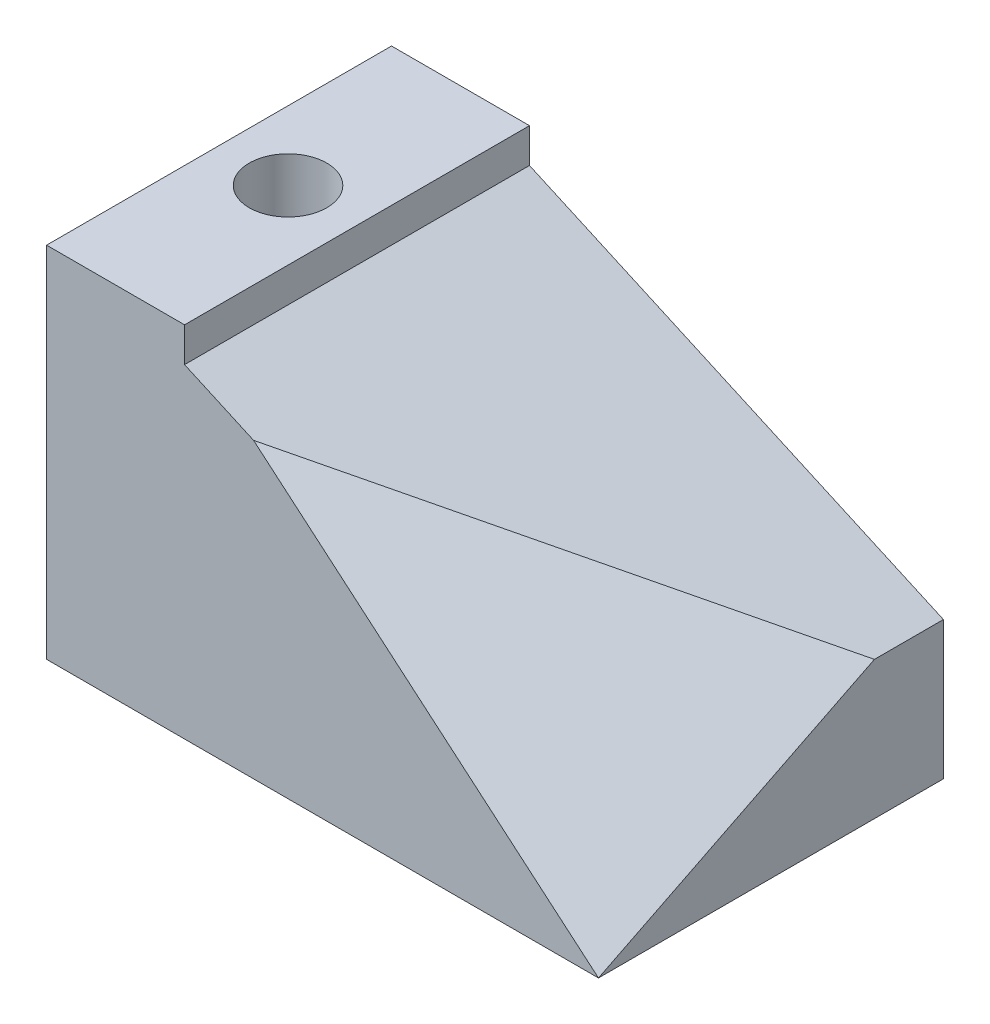
ISO-10303-21;
HEADER;
FILE_DESCRIPTION(('STEP AP214'),'2;1');
FILE_NAME('part.step','',(''),(''),'','','');
FILE_SCHEMA(('AUTOMOTIVE_DESIGN { 1 0 10303 214 1 1 1 1 }'));
ENDSEC;
DATA;
#1=APPLICATION_CONTEXT('core data for automotive mechanical design processes');
#2=APPLICATION_PROTOCOL_DEFINITION('international standard','automotive_design',2000,#1);
#3=PRODUCT_CONTEXT('',#1,'mechanical');
#4=PRODUCT('Part','Part','',(#3));
#5=PRODUCT_RELATED_PRODUCT_CATEGORY('part','',(#4));
#6=PRODUCT_DEFINITION_FORMATION('','',#4);
#7=PRODUCT_DEFINITION_CONTEXT('part definition',#1,'design');
#8=PRODUCT_DEFINITION('design','',#6,#7);
#9=PRODUCT_DEFINITION_SHAPE('','',#8);
#10=(LENGTH_UNIT() NAMED_UNIT(*) SI_UNIT(.MILLI.,.METRE.));
#11=(NAMED_UNIT(*) PLANE_ANGLE_UNIT() SI_UNIT($,.RADIAN.));
#12=(NAMED_UNIT(*) SI_UNIT($,.STERADIAN.) SOLID_ANGLE_UNIT());
#13=UNCERTAINTY_MEASURE_WITH_UNIT(LENGTH_MEASURE(1.E-05),#10,'distance_accuracy_value','');
#14=(GEOMETRIC_REPRESENTATION_CONTEXT(3) GLOBAL_UNCERTAINTY_ASSIGNED_CONTEXT((#13)) GLOBAL_UNIT_ASSIGNED_CONTEXT((#10,
#11,#12)) REPRESENTATION_CONTEXT('',''));
#15=CARTESIAN_POINT('',(0.,0.,0.));
#16=DIRECTION('',(0.,0.,1.));
#17=DIRECTION('',(1.,0.,0.));
#18=AXIS2_PLACEMENT_3D('',#15,#16,#17);
#19=CARTESIAN_POINT('',(0.,0.,63.5));
#20=DIRECTION('',(0.,0.,1.));
#21=DIRECTION('',(1.,0.,0.));
#22=AXIS2_PLACEMENT_3D('',#19,#20,#21);
#23=PLANE('',#22);
#24=DIRECTION('',(1.,0.,0.));
#25=VECTOR('',#24,1.);
#26=CARTESIAN_POINT('',(0.,0.,63.5));
#27=LINE('',#26,#25);
#28=CARTESIAN_POINT('',(0.,0.,63.5));
#29=VERTEX_POINT('',#28);
#30=CARTESIAN_POINT('',(101.6,0.,63.5));
#31=VERTEX_POINT('',#30);
#32=EDGE_CURVE('E124',#29,#31,#27,.T.);
#33=ORIENTED_EDGE('',*,*,#32,.T.);
#34=DIRECTION('',(0.761939317759459,-0.647648420095541,0.));
#35=VECTOR('',#34,1.);
#36=CARTESIAN_POINT('',(38.1,53.975,63.5));
#37=LINE('',#36,#35);
#38=CARTESIAN_POINT('',(38.1,53.975,63.5));
#39=VERTEX_POINT('',#38);
#40=EDGE_CURVE('E129',#39,#31,#37,.T.);
#41=ORIENTED_EDGE('',*,*,#40,.F.);
#42=DIRECTION('',(-0.911921505175106,0.410364677328798,0.));
#43=VECTOR('',#42,1.);
#44=CARTESIAN_POINT('',(101.6,25.4,63.5));
#45=LINE('',#44,#43);
#46=CARTESIAN_POINT('',(25.4,59.69,63.5));
#47=VERTEX_POINT('',#46);
#48=EDGE_CURVE('E147',#39,#47,#45,.T.);
#49=ORIENTED_EDGE('',*,*,#48,.T.);
#50=DIRECTION('',(0.,1.,0.));
#51=VECTOR('',#50,1.);
#52=CARTESIAN_POINT('',(25.4,59.69,63.5));
#53=LINE('',#52,#51);
#54=CARTESIAN_POINT('',(25.4,66.04,63.5));
#55=VERTEX_POINT('',#54);
#56=EDGE_CURVE('E179',#47,#55,#53,.T.);
#57=ORIENTED_EDGE('',*,*,#56,.T.);
#58=DIRECTION('',(-1.,0.,0.));
#59=VECTOR('',#58,1.);
#60=CARTESIAN_POINT('',(25.4,66.04,63.5));
#61=LINE('',#60,#59);
#62=CARTESIAN_POINT('',(0.,66.04,63.5));
#63=VERTEX_POINT('',#62);
#64=EDGE_CURVE('E90',#55,#63,#61,.T.);
#65=ORIENTED_EDGE('',*,*,#64,.T.);
#66=DIRECTION('',(0.,-1.,0.));
#67=VECTOR('',#66,1.);
#68=CARTESIAN_POINT('',(0.,66.04,63.5));
#69=LINE('',#68,#67);
#70=EDGE_CURVE('E145',#63,#29,#69,.T.);
#71=ORIENTED_EDGE('',*,*,#70,.T.);
#72=EDGE_LOOP('',(#33,#41,#49,#57,#65,#71));
#73=FACE_BOUND('',#72,.T.);
#74=ADVANCED_FACE('F64',(#73),#23,.T.);
#75=CARTESIAN_POINT('',(0.,66.04,63.5));
#76=DIRECTION('',(1.,0.,0.));
#77=DIRECTION('',(0.,1.,0.));
#78=AXIS2_PLACEMENT_3D('',#75,#76,#77);
#79=PLANE('',#78);
#80=DIRECTION('',(0.,-1.,0.));
#81=VECTOR('',#80,1.);
#82=CARTESIAN_POINT('',(0.,66.04,0.));
#83=LINE('',#82,#81);
#84=CARTESIAN_POINT('',(0.,66.04,0.));
#85=VERTEX_POINT('',#84);
#86=CARTESIAN_POINT('',(0.,0.,0.));
#87=VERTEX_POINT('',#86);
#88=EDGE_CURVE('E174',#85,#87,#83,.T.);
#89=ORIENTED_EDGE('',*,*,#88,.T.);
#90=DIRECTION('',(0.,0.,-1.));
#91=VECTOR('',#90,1.);
#92=CARTESIAN_POINT('',(0.,0.,63.5));
#93=LINE('',#92,#91);
#94=EDGE_CURVE('E12',#29,#87,#93,.T.);
#95=ORIENTED_EDGE('',*,*,#94,.F.);
#96=ORIENTED_EDGE('',*,*,#70,.F.);
#97=DIRECTION('',(0.,0.,-1.));
#98=VECTOR('',#97,1.);
#99=CARTESIAN_POINT('',(0.,66.04,63.5));
#100=LINE('',#99,#98);
#101=EDGE_CURVE('E164',#63,#85,#100,.T.);
#102=ORIENTED_EDGE('',*,*,#101,.T.);
#103=EDGE_LOOP('',(#89,#95,#96,#102));
#104=FACE_BOUND('',#103,.T.);
#105=ADVANCED_FACE('F66',(#104),#79,.F.);
#106=CARTESIAN_POINT('',(0.,0.,63.5));
#107=DIRECTION('',(0.,1.,0.));
#108=DIRECTION('',(0.,0.,1.));
#109=AXIS2_PLACEMENT_3D('',#106,#107,#108);
#110=PLANE('',#109);
#111=DIRECTION('',(1.,0.,0.));
#112=VECTOR('',#111,1.);
#113=CARTESIAN_POINT('',(0.,0.,0.));
#114=LINE('',#113,#112);
#115=CARTESIAN_POINT('',(101.6,0.,0.));
#116=VERTEX_POINT('',#115);
#117=EDGE_CURVE('E150',#87,#116,#114,.T.);
#118=ORIENTED_EDGE('',*,*,#117,.T.);
#119=DIRECTION('',(0.,0.,-1.));
#120=VECTOR('',#119,1.);
#121=CARTESIAN_POINT('',(101.6,0.,63.5));
#122=LINE('',#121,#120);
#123=EDGE_CURVE('E73',#31,#116,#122,.T.);
#124=ORIENTED_EDGE('',*,*,#123,.F.);
#125=ORIENTED_EDGE('',*,*,#32,.F.);
#126=ORIENTED_EDGE('',*,*,#94,.T.);
#127=EDGE_LOOP('',(#118,#124,#125,#126));
#128=FACE_BOUND('',#127,.T.);
#129=ADVANCED_FACE('F149',(#128),#110,.F.);
#130=CARTESIAN_POINT('',(101.6,0.,63.5));
#131=DIRECTION('',(-1.,0.,0.));
#132=DIRECTION('',(0.,0.,1.));
#133=AXIS2_PLACEMENT_3D('',#130,#131,#132);
#134=PLANE('',#133);
#135=DIRECTION('',(0.,0.,-1.));
#136=VECTOR('',#135,1.);
#137=CARTESIAN_POINT('',(101.6,25.4,63.5));
#138=LINE('',#137,#136);
#139=CARTESIAN_POINT('',(101.6,25.4,12.7));
#140=VERTEX_POINT('',#139);
#141=CARTESIAN_POINT('',(101.6,25.4,0.));
#142=VERTEX_POINT('',#141);
#143=EDGE_CURVE('E142',#140,#142,#138,.T.);
#144=ORIENTED_EDGE('',*,*,#143,.F.);
#145=DIRECTION('',(0.,0.447213595499958,-0.894427190999916));
#146=VECTOR('',#145,1.);
#147=CARTESIAN_POINT('',(101.6,0.,63.5));
#148=LINE('',#147,#146);
#149=EDGE_CURVE('E132',#31,#140,#148,.T.);
#150=ORIENTED_EDGE('',*,*,#149,.F.);
#151=ORIENTED_EDGE('',*,*,#123,.T.);
#152=DIRECTION('',(0.,1.,0.));
#153=VECTOR('',#152,1.);
#154=CARTESIAN_POINT('',(101.6,0.,0.));
#155=LINE('',#154,#153);
#156=EDGE_CURVE('E171',#116,#142,#155,.T.);
#157=ORIENTED_EDGE('',*,*,#156,.T.);
#158=EDGE_LOOP('',(#144,#150,#151,#157));
#159=FACE_BOUND('',#158,.T.);
#160=ADVANCED_FACE('F139',(#159),#134,.F.);
#161=CARTESIAN_POINT('',(101.6,25.4,63.5));
#162=DIRECTION('',(-0.410364677328798,-0.911921505175106,0.));
#163=DIRECTION('',(0.911921505175107,-0.410364677328798,0.));
#164=AXIS2_PLACEMENT_3D('',#161,#162,#163);
#165=PLANE('',#164);
#166=ORIENTED_EDGE('',*,*,#48,.F.);
#167=DIRECTION('',(-0.736709468683757,0.331519260907691,0.589367574947006));
#168=VECTOR('',#167,1.);
#169=CARTESIAN_POINT('',(38.1,53.975,63.5));
#170=LINE('',#169,#168);
#171=EDGE_CURVE('E81',#140,#39,#170,.T.);
#172=ORIENTED_EDGE('',*,*,#171,.F.);
#173=ORIENTED_EDGE('',*,*,#143,.T.);
#174=DIRECTION('',(-0.911921505175106,0.410364677328798,0.));
#175=VECTOR('',#174,1.);
#176=CARTESIAN_POINT('',(101.6,25.4,0.));
#177=LINE('',#176,#175);
#178=CARTESIAN_POINT('',(25.4,59.69,0.));
#179=VERTEX_POINT('',#178);
#180=EDGE_CURVE('E169',#142,#179,#177,.T.);
#181=ORIENTED_EDGE('',*,*,#180,.T.);
#182=DIRECTION('',(0.,0.,-1.));
#183=VECTOR('',#182,1.);
#184=CARTESIAN_POINT('',(25.4,59.69,63.5));
#185=LINE('',#184,#183);
#186=EDGE_CURVE('E151',#47,#179,#185,.T.);
#187=ORIENTED_EDGE('',*,*,#186,.F.);
#188=EDGE_LOOP('',(#166,#172,#173,#181,#187));
#189=FACE_BOUND('',#188,.T.);
#190=ADVANCED_FACE('F214',(#189),#165,.F.);
#191=CARTESIAN_POINT('',(25.4,59.69,63.5));
#192=DIRECTION('',(-1.,0.,0.));
#193=DIRECTION('',(0.,0.,1.));
#194=AXIS2_PLACEMENT_3D('',#191,#192,#193);
#195=PLANE('',#194);
#196=DIRECTION('',(0.,1.,0.));
#197=VECTOR('',#196,1.);
#198=CARTESIAN_POINT('',(25.4,59.69,0.));
#199=LINE('',#198,#197);
#200=CARTESIAN_POINT('',(25.4,66.04,0.));
#201=VERTEX_POINT('',#200);
#202=EDGE_CURVE('E167',#179,#201,#199,.T.);
#203=ORIENTED_EDGE('',*,*,#202,.T.);
#204=DIRECTION('',(0.,0.,-1.));
#205=VECTOR('',#204,1.);
#206=CARTESIAN_POINT('',(25.4,66.04,63.5));
#207=LINE('',#206,#205);
#208=EDGE_CURVE('E162',#55,#201,#207,.T.);
#209=ORIENTED_EDGE('',*,*,#208,.F.);
#210=ORIENTED_EDGE('',*,*,#56,.F.);
#211=ORIENTED_EDGE('',*,*,#186,.T.);
#212=EDGE_LOOP('',(#203,#209,#210,#211));
#213=FACE_BOUND('',#212,.T.);
#214=ADVANCED_FACE('F206',(#213),#195,.F.);
#215=CARTESIAN_POINT('',(25.4,66.04,63.5));
#216=DIRECTION('',(0.,-1.,0.));
#217=DIRECTION('',(0.,0.,-1.));
#218=AXIS2_PLACEMENT_3D('',#215,#216,#217);
#219=PLANE('',#218);
#220=CARTESIAN_POINT('',(12.7,66.04,31.75));
#221=DIRECTION('',(0.,1.,0.));
#222=DIRECTION('',(0.,0.,1.));
#223=AXIS2_PLACEMENT_3D('',#220,#221,#222);
#224=CIRCLE('',#223,7.1374);
#225=CARTESIAN_POINT('',(12.7,66.04,38.8874));
#226=VERTEX_POINT('',#225);
#227=EDGE_CURVE('E134',#226,#226,#224,.T.);
#228=ORIENTED_EDGE('',*,*,#227,.F.);
#229=EDGE_LOOP('',(#228));
#230=FACE_BOUND('',#229,.T.);
#231=DIRECTION('',(-1.,0.,0.));
#232=VECTOR('',#231,1.);
#233=CARTESIAN_POINT('',(25.4,66.04,0.));
#234=LINE('',#233,#232);
#235=EDGE_CURVE('E117',#201,#85,#234,.T.);
#236=ORIENTED_EDGE('',*,*,#235,.T.);
#237=ORIENTED_EDGE('',*,*,#101,.F.);
#238=ORIENTED_EDGE('',*,*,#64,.F.);
#239=ORIENTED_EDGE('',*,*,#208,.T.);
#240=EDGE_LOOP('',(#236,#237,#238,#239));
#241=FACE_BOUND('',#240,.T.);
#242=ADVANCED_FACE('F204',(#230,#241),#219,.F.);
#243=CARTESIAN_POINT('',(0.,0.,0.));
#244=DIRECTION('',(0.,0.,1.));
#245=DIRECTION('',(1.,0.,0.));
#246=AXIS2_PLACEMENT_3D('',#243,#244,#245);
#247=PLANE('',#246);
#248=ORIENTED_EDGE('',*,*,#88,.F.);
#249=ORIENTED_EDGE('',*,*,#235,.F.);
#250=ORIENTED_EDGE('',*,*,#202,.F.);
#251=ORIENTED_EDGE('',*,*,#180,.F.);
#252=ORIENTED_EDGE('',*,*,#156,.F.);
#253=ORIENTED_EDGE('',*,*,#117,.F.);
#254=EDGE_LOOP('',(#248,#249,#250,#251,#252,#253));
#255=FACE_BOUND('',#254,.T.);
#256=ADVANCED_FACE('F200',(#255),#247,.F.);
#257=CARTESIAN_POINT('',(12.7,27.94,31.75));
#258=DIRECTION('',(0.,1.,0.));
#259=DIRECTION('',(0.,0.,1.));
#260=AXIS2_PLACEMENT_3D('',#257,#258,#259);
#261=CYLINDRICAL_SURFACE('',#260,7.1374);
#262=CARTESIAN_POINT('',(12.7,27.94,31.75));
#263=DIRECTION('',(0.,1.,0.));
#264=DIRECTION('',(0.,0.,1.));
#265=AXIS2_PLACEMENT_3D('',#262,#263,#264);
#266=CIRCLE('',#265,7.1374);
#267=CARTESIAN_POINT('',(12.7,27.94,38.8874));
#268=VERTEX_POINT('',#267);
#269=EDGE_CURVE('E177',#268,#268,#266,.T.);
#270=CARTESIAN_POINT('',(12.7,27.94,38.8874));
#271=CARTESIAN_POINT('',(12.7,28.336875,38.8874));
#272=CARTESIAN_POINT('',(12.7,28.73375,38.8874));
#273=CARTESIAN_POINT('',(12.7,29.5275,38.8874));
#274=CARTESIAN_POINT('',(12.7,29.924375,38.8874));
#275=CARTESIAN_POINT('',(12.7,30.718125,38.8874));
#276=CARTESIAN_POINT('',(12.7,31.115,38.8874));
#277=CARTESIAN_POINT('',(12.7,31.90875,38.8874));
#278=CARTESIAN_POINT('',(12.7,32.305625,38.8874));
#279=CARTESIAN_POINT('',(12.7,33.099375,38.8874));
#280=CARTESIAN_POINT('',(12.7,33.49625,38.8874));
#281=CARTESIAN_POINT('',(12.7,34.29,38.8874));
#282=CARTESIAN_POINT('',(12.7,34.686875,38.8874));
#283=CARTESIAN_POINT('',(12.7,35.480625,38.8874));
#284=CARTESIAN_POINT('',(12.7,35.8775,38.8874));
#285=CARTESIAN_POINT('',(12.7,36.67125,38.8874));
#286=CARTESIAN_POINT('',(12.7,37.068125,38.8874));
#287=CARTESIAN_POINT('',(12.7,37.861875,38.8874));
#288=CARTESIAN_POINT('',(12.7,38.25875,38.8874));
#289=CARTESIAN_POINT('',(12.7,39.0525,38.8874));
#290=CARTESIAN_POINT('',(12.7,39.449375,38.8874));
#291=CARTESIAN_POINT('',(12.7,40.243125,38.8874));
#292=CARTESIAN_POINT('',(12.7,40.64,38.8874));
#293=CARTESIAN_POINT('',(12.7,41.43375,38.8874));
#294=CARTESIAN_POINT('',(12.7,41.830625,38.8874));
#295=CARTESIAN_POINT('',(12.7,42.624375,38.8874));
#296=CARTESIAN_POINT('',(12.7,43.02125,38.8874));
#297=CARTESIAN_POINT('',(12.7,43.815,38.8874));
#298=CARTESIAN_POINT('',(12.7,44.211875,38.8874));
#299=CARTESIAN_POINT('',(12.7,45.005625,38.8874));
#300=CARTESIAN_POINT('',(12.7,45.4025,38.8874));
#301=CARTESIAN_POINT('',(12.7,46.19625,38.8874));
#302=CARTESIAN_POINT('',(12.7,46.593125,38.8874));
#303=CARTESIAN_POINT('',(12.7,47.386875,38.8874));
#304=CARTESIAN_POINT('',(12.7,47.78375,38.8874));
#305=CARTESIAN_POINT('',(12.7,48.5775,38.8874));
#306=CARTESIAN_POINT('',(12.7,48.974375,38.8874));
#307=CARTESIAN_POINT('',(12.7,49.768125,38.8874));
#308=CARTESIAN_POINT('',(12.7,50.165,38.8874));
#309=CARTESIAN_POINT('',(12.7,50.95875,38.8874));
#310=CARTESIAN_POINT('',(12.7,51.355625,38.8874));
#311=CARTESIAN_POINT('',(12.7,52.149375,38.8874));
#312=CARTESIAN_POINT('',(12.7,52.54625,38.8874));
#313=CARTESIAN_POINT('',(12.7,53.34,38.8874));
#314=CARTESIAN_POINT('',(12.7,53.736875,38.8874));
#315=CARTESIAN_POINT('',(12.7,54.530625,38.8874));
#316=CARTESIAN_POINT('',(12.7,54.9275,38.8874));
#317=CARTESIAN_POINT('',(12.7,55.72125,38.8874));
#318=CARTESIAN_POINT('',(12.7,56.118125,38.8874));
#319=CARTESIAN_POINT('',(12.7,56.911875,38.8874));
#320=CARTESIAN_POINT('',(12.7,57.30875,38.8874));
#321=CARTESIAN_POINT('',(12.7,58.1025,38.8874));
#322=CARTESIAN_POINT('',(12.7,58.499375,38.8874));
#323=CARTESIAN_POINT('',(12.7,59.293125,38.8874));
#324=CARTESIAN_POINT('',(12.7,59.69,38.8874));
#325=CARTESIAN_POINT('',(12.7,60.48375,38.8874));
#326=CARTESIAN_POINT('',(12.7,60.880625,38.8874));
#327=CARTESIAN_POINT('',(12.7,61.674375,38.8874));
#328=CARTESIAN_POINT('',(12.7,62.07125,38.8874));
#329=CARTESIAN_POINT('',(12.7,62.865,38.8874));
#330=CARTESIAN_POINT('',(12.7,63.261875,38.8874));
#331=CARTESIAN_POINT('',(12.7,64.055625,38.8874));
#332=CARTESIAN_POINT('',(12.7,64.4525,38.8874));
#333=CARTESIAN_POINT('',(12.7,65.24625,38.8874));
#334=CARTESIAN_POINT('',(12.7,65.643125,38.8874));
#335=CARTESIAN_POINT('',(12.7,66.04,38.8874));
#336=B_SPLINE_CURVE_WITH_KNOTS('',3,(#270,#271,#272,#273,#274,#275,#276,#277,#278,#279,#280,
#281,#282,#283,#284,#285,#286,#287,#288,#289,#290,#291,#292,#293,#294,#295,#296,#297,#298,#299,
#300,#301,#302,#303,#304,#305,#306,#307,#308,#309,#310,#311,#312,#313,#314,#315,#316,#317,#318,
#319,#320,#321,#322,#323,#324,#325,#326,#327,#328,#329,#330,#331,#332,#333,#334,#335),
.UNSPECIFIED.,.F.,.F.,(4,2,2,2,2,2,2,2,2,2,2,2,2,2,2,2,2,2,2,2,2,2,2,2,2,2,2,2,2,2,2,2,4),(0.,
1.190625,2.38125,3.571875,4.7625,5.953125,7.14375,8.334375,9.525,10.715625,11.90625,13.096875,
14.2875,15.478125,16.66875,17.859375,19.05,20.240625,21.43125,22.621875,23.8125,25.003125,
26.19375,27.384375,28.575,29.765625,30.95625,32.146875,33.3375,34.528125,35.71875,36.909375,
38.1),.UNSPECIFIED.);
#337=EDGE_CURVE('BSEAM197',#268,#226,#336,.T.);
#338=ORIENTED_EDGE('',*,*,#269,.F.);
#339=ORIENTED_EDGE('',*,*,#227,.T.);
#340=ORIENTED_EDGE('',*,*,#337,.T.);
#341=ORIENTED_EDGE('',*,*,#337,.F.);
#342=EDGE_LOOP('',(#338,#340,#339,#341));
#343=FACE_BOUND('',#342,.T.);
#344=ADVANCED_FACE('F197',(#343),#261,.F.);
#345=CARTESIAN_POINT('',(12.7,27.94,31.75));
#346=DIRECTION('',(0.,1.,0.));
#347=DIRECTION('',(0.,0.,1.));
#348=AXIS2_PLACEMENT_3D('',#345,#346,#347);
#349=PLANE('',#348);
#350=ORIENTED_EDGE('',*,*,#269,.T.);
#351=EDGE_LOOP('',(#350));
#352=FACE_BOUND('',#351,.T.);
#353=ADVANCED_FACE('F195',(#352),#349,.T.);
#354=CARTESIAN_POINT('',(50.896577946768,59.8783269961977,29.9391634980989));
#355=DIRECTION('',(0.605216026332568,0.712018854508904,0.356009427254453));
#356=DIRECTION('',(-0.76193931775946,0.64764842009554,0.));
#357=AXIS2_PLACEMENT_3D('',#354,#355,#356);
#358=PLANE('',#357);
#359=ORIENTED_EDGE('',*,*,#171,.T.);
#360=ORIENTED_EDGE('',*,*,#40,.T.);
#361=ORIENTED_EDGE('',*,*,#149,.T.);
#362=EDGE_LOOP('',(#359,#360,#361));
#363=FACE_BOUND('',#362,.T.);
#364=ADVANCED_FACE('F131',(#363),#358,.T.);
#365=CLOSED_SHELL('',(#74,#105,#129,#160,#190,#214,#242,#256,#344,#353,#364));
#366=MANIFOLD_SOLID_BREP('B2',#365);
#367=ADVANCED_BREP_SHAPE_REPRESENTATION('',(#18,#366),#14);
#368=SHAPE_DEFINITION_REPRESENTATION(#9,#367);
ENDSEC;
END-ISO-10303-21;
